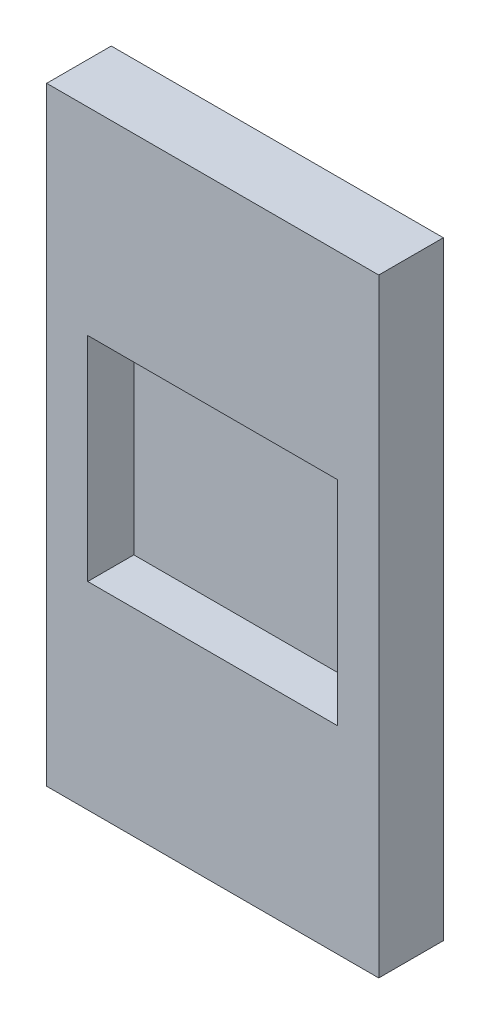
ISO-10303-21;
HEADER;
FILE_DESCRIPTION(('STEP AP214'),'2;1');
FILE_NAME('part.step','',(''),(''),'','','');
FILE_SCHEMA(('AUTOMOTIVE_DESIGN { 1 0 10303 214 1 1 1 1 }'));
ENDSEC;
DATA;
#1=APPLICATION_CONTEXT('core data for automotive mechanical design processes');
#2=APPLICATION_PROTOCOL_DEFINITION('international standard','automotive_design',2000,#1);
#3=PRODUCT_CONTEXT('',#1,'mechanical');
#4=PRODUCT('Part','Part','',(#3));
#5=PRODUCT_RELATED_PRODUCT_CATEGORY('part','',(#4));
#6=PRODUCT_DEFINITION_FORMATION('','',#4);
#7=PRODUCT_DEFINITION_CONTEXT('part definition',#1,'design');
#8=PRODUCT_DEFINITION('design','',#6,#7);
#9=PRODUCT_DEFINITION_SHAPE('','',#8);
#10=(LENGTH_UNIT() NAMED_UNIT(*) SI_UNIT(.MILLI.,.METRE.));
#11=(NAMED_UNIT(*) PLANE_ANGLE_UNIT() SI_UNIT($,.RADIAN.));
#12=(NAMED_UNIT(*) SI_UNIT($,.STERADIAN.) SOLID_ANGLE_UNIT());
#13=UNCERTAINTY_MEASURE_WITH_UNIT(LENGTH_MEASURE(1.E-05),#10,'distance_accuracy_value','');
#14=(GEOMETRIC_REPRESENTATION_CONTEXT(3) GLOBAL_UNCERTAINTY_ASSIGNED_CONTEXT((#13)) GLOBAL_UNIT_ASSIGNED_CONTEXT((#10,
#11,#12)) REPRESENTATION_CONTEXT('',''));
#15=CARTESIAN_POINT('',(0.,0.,0.));
#16=DIRECTION('',(0.,0.,1.));
#17=DIRECTION('',(1.,0.,0.));
#18=AXIS2_PLACEMENT_3D('',#15,#16,#17);
#19=CARTESIAN_POINT('',(9.,-16.5,3.5));
#20=DIRECTION('',(-1.,0.,0.));
#21=DIRECTION('',(0.,0.,1.));
#22=AXIS2_PLACEMENT_3D('',#19,#20,#21);
#23=PLANE('',#22);
#24=DIRECTION('',(0.,1.,0.));
#25=VECTOR('',#24,1.);
#26=CARTESIAN_POINT('',(9.,-16.5,0.));
#27=LINE('',#26,#25);
#28=CARTESIAN_POINT('',(9.,-16.5,0.));
#29=VERTEX_POINT('',#28);
#30=CARTESIAN_POINT('',(9.,16.5,0.));
#31=VERTEX_POINT('',#30);
#32=EDGE_CURVE('E158',#29,#31,#27,.T.);
#33=ORIENTED_EDGE('',*,*,#32,.T.);
#34=DIRECTION('',(0.,0.,-1.));
#35=VECTOR('',#34,1.);
#36=CARTESIAN_POINT('',(9.,16.5,3.5));
#37=LINE('',#36,#35);
#38=CARTESIAN_POINT('',(9.,16.5,3.5));
#39=VERTEX_POINT('',#38);
#40=EDGE_CURVE('E11',#39,#31,#37,.T.);
#41=ORIENTED_EDGE('',*,*,#40,.F.);
#42=DIRECTION('',(0.,1.,0.));
#43=VECTOR('',#42,1.);
#44=CARTESIAN_POINT('',(9.,-16.5,3.5));
#45=LINE('',#44,#43);
#46=CARTESIAN_POINT('',(9.,-16.5,3.5));
#47=VERTEX_POINT('',#46);
#48=EDGE_CURVE('E164',#47,#39,#45,.T.);
#49=ORIENTED_EDGE('',*,*,#48,.F.);
#50=DIRECTION('',(0.,0.,-1.));
#51=VECTOR('',#50,1.);
#52=CARTESIAN_POINT('',(9.,-16.5,3.5));
#53=LINE('',#52,#51);
#54=EDGE_CURVE('E174',#47,#29,#53,.T.);
#55=ORIENTED_EDGE('',*,*,#54,.T.);
#56=EDGE_LOOP('',(#33,#41,#49,#55));
#57=FACE_BOUND('',#56,.T.);
#58=ADVANCED_FACE('F39',(#57),#23,.F.);
#59=CARTESIAN_POINT('',(-9.,16.5,3.5));
#60=DIRECTION('',(0.,-1.,0.));
#61=DIRECTION('',(0.,0.,-1.));
#62=AXIS2_PLACEMENT_3D('',#59,#60,#61);
#63=PLANE('',#62);
#64=DIRECTION('',(-1.,0.,0.));
#65=VECTOR('',#64,1.);
#66=CARTESIAN_POINT('',(-9.,16.5,0.));
#67=LINE('',#66,#65);
#68=CARTESIAN_POINT('',(-9.,16.5,0.));
#69=VERTEX_POINT('',#68);
#70=EDGE_CURVE('E178',#31,#69,#67,.T.);
#71=ORIENTED_EDGE('',*,*,#70,.T.);
#72=DIRECTION('',(0.,0.,-1.));
#73=VECTOR('',#72,1.);
#74=CARTESIAN_POINT('',(-9.,16.5,3.5));
#75=LINE('',#74,#73);
#76=CARTESIAN_POINT('',(-9.,16.5,3.5));
#77=VERTEX_POINT('',#76);
#78=EDGE_CURVE('E47',#77,#69,#75,.T.);
#79=ORIENTED_EDGE('',*,*,#78,.F.);
#80=DIRECTION('',(-1.,0.,0.));
#81=VECTOR('',#80,1.);
#82=CARTESIAN_POINT('',(-9.,16.5,3.5));
#83=LINE('',#82,#81);
#84=EDGE_CURVE('E91',#39,#77,#83,.T.);
#85=ORIENTED_EDGE('',*,*,#84,.F.);
#86=ORIENTED_EDGE('',*,*,#40,.T.);
#87=EDGE_LOOP('',(#71,#79,#85,#86));
#88=FACE_BOUND('',#87,.T.);
#89=ADVANCED_FACE('F213',(#88),#63,.F.);
#90=CARTESIAN_POINT('',(-9.,-16.5,3.5));
#91=DIRECTION('',(1.,0.,0.));
#92=DIRECTION('',(0.,0.,-1.));
#93=AXIS2_PLACEMENT_3D('',#90,#91,#92);
#94=PLANE('',#93);
#95=DIRECTION('',(0.,-1.,0.));
#96=VECTOR('',#95,1.);
#97=CARTESIAN_POINT('',(-9.,-16.5,0.));
#98=LINE('',#97,#96);
#99=CARTESIAN_POINT('',(-9.,-16.5,0.));
#100=VERTEX_POINT('',#99);
#101=EDGE_CURVE('E181',#69,#100,#98,.T.);
#102=ORIENTED_EDGE('',*,*,#101,.T.);
#103=DIRECTION('',(0.,0.,-1.));
#104=VECTOR('',#103,1.);
#105=CARTESIAN_POINT('',(-9.,-16.5,3.5));
#106=LINE('',#105,#104);
#107=CARTESIAN_POINT('',(-9.,-16.5,3.5));
#108=VERTEX_POINT('',#107);
#109=EDGE_CURVE('E188',#108,#100,#106,.T.);
#110=ORIENTED_EDGE('',*,*,#109,.F.);
#111=DIRECTION('',(0.,-1.,0.));
#112=VECTOR('',#111,1.);
#113=CARTESIAN_POINT('',(-9.,-16.5,3.5));
#114=LINE('',#113,#112);
#115=EDGE_CURVE('E169',#77,#108,#114,.T.);
#116=ORIENTED_EDGE('',*,*,#115,.F.);
#117=ORIENTED_EDGE('',*,*,#78,.T.);
#118=EDGE_LOOP('',(#102,#110,#116,#117));
#119=FACE_BOUND('',#118,.T.);
#120=ADVANCED_FACE('F195',(#119),#94,.F.);
#121=CARTESIAN_POINT('',(-9.,-16.5,3.5));
#122=DIRECTION('',(0.,1.,0.));
#123=DIRECTION('',(0.,0.,1.));
#124=AXIS2_PLACEMENT_3D('',#121,#122,#123);
#125=PLANE('',#124);
#126=DIRECTION('',(1.,0.,0.));
#127=VECTOR('',#126,1.);
#128=CARTESIAN_POINT('',(-9.,-16.5,0.));
#129=LINE('',#128,#127);
#130=EDGE_CURVE('E84',#100,#29,#129,.T.);
#131=ORIENTED_EDGE('',*,*,#130,.T.);
#132=ORIENTED_EDGE('',*,*,#54,.F.);
#133=DIRECTION('',(1.,0.,0.));
#134=VECTOR('',#133,1.);
#135=CARTESIAN_POINT('',(-9.,-16.5,3.5));
#136=LINE('',#135,#134);
#137=EDGE_CURVE('E63',#108,#47,#136,.T.);
#138=ORIENTED_EDGE('',*,*,#137,.F.);
#139=ORIENTED_EDGE('',*,*,#109,.T.);
#140=EDGE_LOOP('',(#131,#132,#138,#139));
#141=FACE_BOUND('',#140,.T.);
#142=ADVANCED_FACE('F203',(#141),#125,.F.);
#143=CARTESIAN_POINT('',(0.,0.,3.5));
#144=DIRECTION('',(0.,0.,-1.));
#145=DIRECTION('',(-1.,0.,0.));
#146=AXIS2_PLACEMENT_3D('',#143,#144,#145);
#147=PLANE('',#146);
#148=DIRECTION('',(-1.,0.,0.));
#149=VECTOR('',#148,1.);
#150=CARTESIAN_POINT('',(-6.775,5.775,3.5));
#151=LINE('',#150,#149);
#152=CARTESIAN_POINT('',(6.775,5.775,3.5));
#153=VERTEX_POINT('',#152);
#154=CARTESIAN_POINT('',(-6.775,5.775,3.5));
#155=VERTEX_POINT('',#154);
#156=EDGE_CURVE('E149',#153,#155,#151,.T.);
#157=ORIENTED_EDGE('',*,*,#156,.F.);
#158=DIRECTION('',(0.,1.,0.));
#159=VECTOR('',#158,1.);
#160=CARTESIAN_POINT('',(6.775,-5.775,3.5));
#161=LINE('',#160,#159);
#162=CARTESIAN_POINT('',(6.775,-5.775,3.5));
#163=VERTEX_POINT('',#162);
#164=EDGE_CURVE('E54',#163,#153,#161,.T.);
#165=ORIENTED_EDGE('',*,*,#164,.F.);
#166=DIRECTION('',(1.,0.,0.));
#167=VECTOR('',#166,1.);
#168=CARTESIAN_POINT('',(-6.775,-5.775,3.5));
#169=LINE('',#168,#167);
#170=CARTESIAN_POINT('',(-6.775,-5.775,3.5));
#171=VERTEX_POINT('',#170);
#172=EDGE_CURVE('E136',#171,#163,#169,.T.);
#173=ORIENTED_EDGE('',*,*,#172,.F.);
#174=DIRECTION('',(0.,-1.,0.));
#175=VECTOR('',#174,1.);
#176=CARTESIAN_POINT('',(-6.775,-5.775,3.5));
#177=LINE('',#176,#175);
#178=EDGE_CURVE('E140',#155,#171,#177,.T.);
#179=ORIENTED_EDGE('',*,*,#178,.F.);
#180=EDGE_LOOP('',(#157,#165,#173,#179));
#181=FACE_BOUND('',#180,.T.);
#182=ORIENTED_EDGE('',*,*,#48,.T.);
#183=ORIENTED_EDGE('',*,*,#84,.T.);
#184=ORIENTED_EDGE('',*,*,#115,.T.);
#185=ORIENTED_EDGE('',*,*,#137,.T.);
#186=EDGE_LOOP('',(#182,#183,#184,#185));
#187=FACE_BOUND('',#186,.T.);
#188=ADVANCED_FACE('F205',(#181,#187),#147,.F.);
#189=CARTESIAN_POINT('',(0.,0.,0.));
#190=DIRECTION('',(0.,0.,-1.));
#191=DIRECTION('',(-1.,0.,0.));
#192=AXIS2_PLACEMENT_3D('',#189,#190,#191);
#193=PLANE('',#192);
#194=ORIENTED_EDGE('',*,*,#32,.F.);
#195=ORIENTED_EDGE('',*,*,#130,.F.);
#196=ORIENTED_EDGE('',*,*,#101,.F.);
#197=ORIENTED_EDGE('',*,*,#70,.F.);
#198=EDGE_LOOP('',(#194,#195,#196,#197));
#199=FACE_BOUND('',#198,.T.);
#200=ADVANCED_FACE('F199',(#199),#193,.T.);
#201=CARTESIAN_POINT('',(6.775,-5.775,1.));
#202=DIRECTION('',(1.,0.,0.));
#203=DIRECTION('',(0.,0.,-1.));
#204=AXIS2_PLACEMENT_3D('',#201,#202,#203);
#205=PLANE('',#204);
#206=ORIENTED_EDGE('',*,*,#164,.T.);
#207=DIRECTION('',(0.,0.,1.));
#208=VECTOR('',#207,1.);
#209=CARTESIAN_POINT('',(6.775,5.775,1.));
#210=LINE('',#209,#208);
#211=CARTESIAN_POINT('',(6.775,5.775,1.));
#212=VERTEX_POINT('',#211);
#213=EDGE_CURVE('E111',#212,#153,#210,.T.);
#214=ORIENTED_EDGE('',*,*,#213,.F.);
#215=DIRECTION('',(0.,1.,0.));
#216=VECTOR('',#215,1.);
#217=CARTESIAN_POINT('',(6.775,-5.775,1.));
#218=LINE('',#217,#216);
#219=CARTESIAN_POINT('',(6.775,-5.775,1.));
#220=VERTEX_POINT('',#219);
#221=EDGE_CURVE('E115',#220,#212,#218,.T.);
#222=ORIENTED_EDGE('',*,*,#221,.F.);
#223=DIRECTION('',(0.,0.,1.));
#224=VECTOR('',#223,1.);
#225=CARTESIAN_POINT('',(6.775,-5.775,1.));
#226=LINE('',#225,#224);
#227=EDGE_CURVE('E155',#220,#163,#226,.T.);
#228=ORIENTED_EDGE('',*,*,#227,.T.);
#229=EDGE_LOOP('',(#206,#214,#222,#228));
#230=FACE_BOUND('',#229,.T.);
#231=ADVANCED_FACE('F113',(#230),#205,.F.);
#232=CARTESIAN_POINT('',(-6.775,-5.775,1.));
#233=DIRECTION('',(0.,-1.,0.));
#234=DIRECTION('',(0.,0.,-1.));
#235=AXIS2_PLACEMENT_3D('',#232,#233,#234);
#236=PLANE('',#235);
#237=ORIENTED_EDGE('',*,*,#172,.T.);
#238=ORIENTED_EDGE('',*,*,#227,.F.);
#239=DIRECTION('',(1.,0.,0.));
#240=VECTOR('',#239,1.);
#241=CARTESIAN_POINT('',(-6.775,-5.775,1.));
#242=LINE('',#241,#240);
#243=CARTESIAN_POINT('',(-6.775,-5.775,1.));
#244=VERTEX_POINT('',#243);
#245=EDGE_CURVE('E122',#244,#220,#242,.T.);
#246=ORIENTED_EDGE('',*,*,#245,.F.);
#247=DIRECTION('',(0.,0.,1.));
#248=VECTOR('',#247,1.);
#249=CARTESIAN_POINT('',(-6.775,-5.775,1.));
#250=LINE('',#249,#248);
#251=EDGE_CURVE('E159',#244,#171,#250,.T.);
#252=ORIENTED_EDGE('',*,*,#251,.T.);
#253=EDGE_LOOP('',(#237,#238,#246,#252));
#254=FACE_BOUND('',#253,.T.);
#255=ADVANCED_FACE('F252',(#254),#236,.F.);
#256=CARTESIAN_POINT('',(-6.775,-5.775,1.));
#257=DIRECTION('',(-1.,0.,0.));
#258=DIRECTION('',(0.,0.,1.));
#259=AXIS2_PLACEMENT_3D('',#256,#257,#258);
#260=PLANE('',#259);
#261=ORIENTED_EDGE('',*,*,#178,.T.);
#262=ORIENTED_EDGE('',*,*,#251,.F.);
#263=DIRECTION('',(0.,-1.,0.));
#264=VECTOR('',#263,1.);
#265=CARTESIAN_POINT('',(-6.775,-5.775,1.));
#266=LINE('',#265,#264);
#267=CARTESIAN_POINT('',(-6.775,5.775,1.));
#268=VERTEX_POINT('',#267);
#269=EDGE_CURVE('E131',#268,#244,#266,.T.);
#270=ORIENTED_EDGE('',*,*,#269,.F.);
#271=DIRECTION('',(0.,0.,1.));
#272=VECTOR('',#271,1.);
#273=CARTESIAN_POINT('',(-6.775,5.775,1.));
#274=LINE('',#273,#272);
#275=EDGE_CURVE('E121',#268,#155,#274,.T.);
#276=ORIENTED_EDGE('',*,*,#275,.T.);
#277=EDGE_LOOP('',(#261,#262,#270,#276));
#278=FACE_BOUND('',#277,.T.);
#279=ADVANCED_FACE('F261',(#278),#260,.F.);
#280=CARTESIAN_POINT('',(-6.775,5.775,1.));
#281=DIRECTION('',(0.,1.,0.));
#282=DIRECTION('',(0.,0.,1.));
#283=AXIS2_PLACEMENT_3D('',#280,#281,#282);
#284=PLANE('',#283);
#285=ORIENTED_EDGE('',*,*,#156,.T.);
#286=ORIENTED_EDGE('',*,*,#275,.F.);
#287=DIRECTION('',(-1.,0.,0.));
#288=VECTOR('',#287,1.);
#289=CARTESIAN_POINT('',(-6.775,5.775,1.));
#290=LINE('',#289,#288);
#291=EDGE_CURVE('E125',#212,#268,#290,.T.);
#292=ORIENTED_EDGE('',*,*,#291,.F.);
#293=ORIENTED_EDGE('',*,*,#213,.T.);
#294=EDGE_LOOP('',(#285,#286,#292,#293));
#295=FACE_BOUND('',#294,.T.);
#296=ADVANCED_FACE('F126',(#295),#284,.F.);
#297=CARTESIAN_POINT('',(0.,0.,1.));
#298=DIRECTION('',(0.,0.,-1.));
#299=DIRECTION('',(-1.,0.,0.));
#300=AXIS2_PLACEMENT_3D('',#297,#298,#299);
#301=PLANE('',#300);
#302=ORIENTED_EDGE('',*,*,#221,.T.);
#303=ORIENTED_EDGE('',*,*,#291,.T.);
#304=ORIENTED_EDGE('',*,*,#269,.T.);
#305=ORIENTED_EDGE('',*,*,#245,.T.);
#306=EDGE_LOOP('',(#302,#303,#304,#305));
#307=FACE_BOUND('',#306,.T.);
#308=ADVANCED_FACE('F133',(#307),#301,.F.);
#309=CLOSED_SHELL('',(#58,#89,#120,#142,#188,#200,#231,#255,#279,#296,#308));
#310=MANIFOLD_SOLID_BREP('B2',#309);
#311=ADVANCED_BREP_SHAPE_REPRESENTATION('',(#18,#310),#14);
#312=SHAPE_DEFINITION_REPRESENTATION(#9,#311);
ENDSEC;
END-ISO-10303-21;
